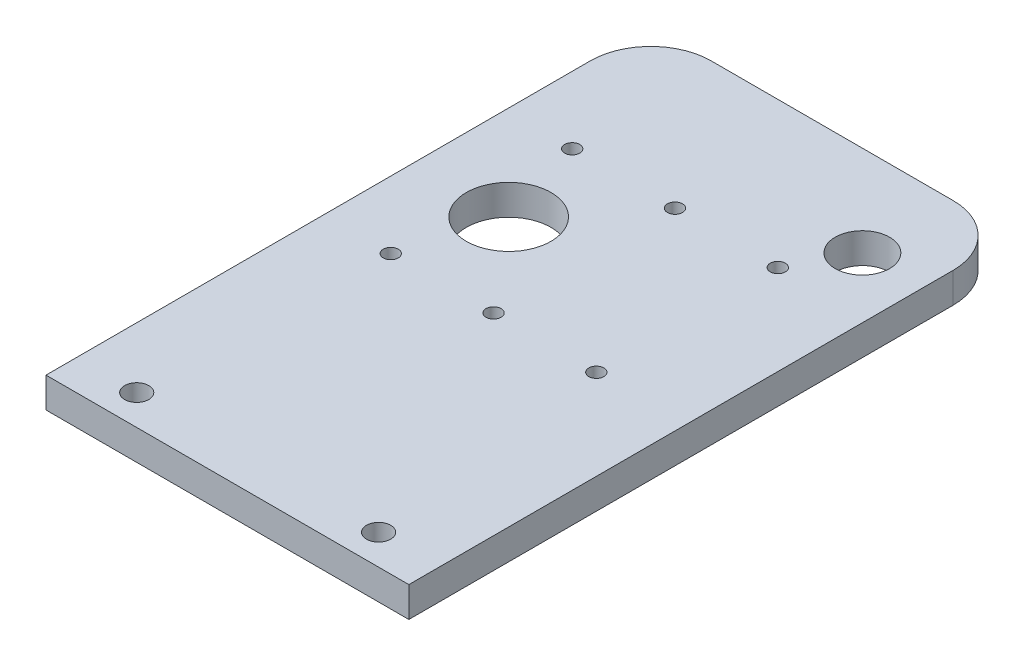
ISO-10303-21;
HEADER;
FILE_DESCRIPTION(('STEP AP214'),'2;1');
FILE_NAME('part.step','',(''),(''),'','','');
FILE_SCHEMA(('AUTOMOTIVE_DESIGN { 1 0 10303 214 1 1 1 1 }'));
ENDSEC;
DATA;
#1=APPLICATION_CONTEXT('core data for automotive mechanical design processes');
#2=APPLICATION_PROTOCOL_DEFINITION('international standard','automotive_design',2000,#1);
#3=PRODUCT_CONTEXT('',#1,'mechanical');
#4=PRODUCT('Part','Part','',(#3));
#5=PRODUCT_RELATED_PRODUCT_CATEGORY('part','',(#4));
#6=PRODUCT_DEFINITION_FORMATION('','',#4);
#7=PRODUCT_DEFINITION_CONTEXT('part definition',#1,'design');
#8=PRODUCT_DEFINITION('design','',#6,#7);
#9=PRODUCT_DEFINITION_SHAPE('','',#8);
#10=(LENGTH_UNIT() NAMED_UNIT(*) SI_UNIT(.MILLI.,.METRE.));
#11=(NAMED_UNIT(*) PLANE_ANGLE_UNIT() SI_UNIT($,.RADIAN.));
#12=(NAMED_UNIT(*) SI_UNIT($,.STERADIAN.) SOLID_ANGLE_UNIT());
#13=UNCERTAINTY_MEASURE_WITH_UNIT(LENGTH_MEASURE(1.E-05),#10,'distance_accuracy_value','');
#14=(GEOMETRIC_REPRESENTATION_CONTEXT(3) GLOBAL_UNCERTAINTY_ASSIGNED_CONTEXT((#13)) GLOBAL_UNIT_ASSIGNED_CONTEXT((#10,
#11,#12)) REPRESENTATION_CONTEXT('',''));
#15=CARTESIAN_POINT('',(0.,0.,0.));
#16=DIRECTION('',(0.,0.,1.));
#17=DIRECTION('',(1.,0.,0.));
#18=AXIS2_PLACEMENT_3D('',#15,#16,#17);
#19=CARTESIAN_POINT('',(-15.3287385690482,5.,-31.4506588296266));
#20=DIRECTION('',(0.,-1.,0.));
#21=DIRECTION('',(0.,0.,-1.));
#22=AXIS2_PLACEMENT_3D('',#19,#20,#21);
#23=PLANE('',#22);
#24=DIRECTION('',(1.,0.,0.));
#25=VECTOR('',#24,1.);
#26=CARTESIAN_POINT('',(-65.3287385690483,5.,58.5493411703734));
#27=LINE('',#26,#25);
#28=CARTESIAN_POINT('',(-65.3287385690483,5.,58.5493411703734));
#29=VERTEX_POINT('',#28);
#30=CARTESIAN_POINT('',(-5.32873856904824,5.,58.5493411703734));
#31=VERTEX_POINT('',#30);
#32=EDGE_CURVE('E93',#29,#31,#27,.T.);
#33=ORIENTED_EDGE('',*,*,#32,.T.);
#34=DIRECTION('',(0.,0.,-1.));
#35=VECTOR('',#34,1.);
#36=CARTESIAN_POINT('',(-5.32873856904824,5.,58.5493411703734));
#37=LINE('',#36,#35);
#38=CARTESIAN_POINT('',(-5.32873856904824,5.,-31.4506588296265));
#39=VERTEX_POINT('',#38);
#40=EDGE_CURVE('E165',#31,#39,#37,.T.);
#41=ORIENTED_EDGE('',*,*,#40,.T.);
#42=CARTESIAN_POINT('',(-15.3287385690482,5.,-31.4506588296266));
#43=DIRECTION('',(0.,1.,0.));
#44=DIRECTION('',(0.,0.,-1.));
#45=AXIS2_PLACEMENT_3D('',#42,#43,#44);
#46=CIRCLE('',#45,10.);
#47=CARTESIAN_POINT('',(-15.3287385690483,5.,-41.4506588296266));
#48=VERTEX_POINT('',#47);
#49=EDGE_CURVE('E107',#39,#48,#46,.T.);
#50=ORIENTED_EDGE('',*,*,#49,.T.);
#51=DIRECTION('',(-1.,0.,0.));
#52=VECTOR('',#51,1.);
#53=CARTESIAN_POINT('',(-55.3287385690482,5.,-41.4506588296266));
#54=LINE('',#53,#52);
#55=CARTESIAN_POINT('',(-55.3287385690483,5.,-41.4506588296266));
#56=VERTEX_POINT('',#55);
#57=EDGE_CURVE('E101',#48,#56,#54,.T.);
#58=ORIENTED_EDGE('',*,*,#57,.T.);
#59=CARTESIAN_POINT('',(-55.3287385690483,5.,-31.4506588296266));
#60=DIRECTION('',(0.,1.,0.));
#61=DIRECTION('',(0.,0.,-1.));
#62=AXIS2_PLACEMENT_3D('',#59,#60,#61);
#63=CIRCLE('',#62,9.99999999999999);
#64=CARTESIAN_POINT('',(-65.3287385690483,5.,-31.4506588296265));
#65=VERTEX_POINT('',#64);
#66=EDGE_CURVE('E105',#56,#65,#63,.T.);
#67=ORIENTED_EDGE('',*,*,#66,.T.);
#68=DIRECTION('',(0.,0.,1.));
#69=VECTOR('',#68,1.);
#70=CARTESIAN_POINT('',(-65.3287385690483,5.,-31.4506588296265));
#71=LINE('',#70,#69);
#72=EDGE_CURVE('E57',#65,#29,#71,.T.);
#73=ORIENTED_EDGE('',*,*,#72,.T.);
#74=EDGE_LOOP('',(#33,#41,#50,#58,#67,#73));
#75=FACE_BOUND('',#74,.T.);
#76=CARTESIAN_POINT('',(-49.7287385690482,5.,-2.36065882962656));
#77=DIRECTION('',(0.,1.,0.));
#78=DIRECTION('',(0.,0.,1.));
#79=AXIS2_PLACEMENT_3D('',#76,#77,#78);
#80=CIRCLE('',#79,7.);
#81=CARTESIAN_POINT('',(-49.7287385690482,5.,4.63934117037344));
#82=VERTEX_POINT('',#81);
#83=EDGE_CURVE('E132',#82,#82,#80,.T.);
#84=ORIENTED_EDGE('',*,*,#83,.F.);
#85=EDGE_LOOP('',(#84));
#86=FACE_BOUND('',#85,.T.);
#87=CARTESIAN_POINT('',(-55.3287385690482,5.,53.5493411703734));
#88=DIRECTION('',(0.,1.,0.));
#89=DIRECTION('',(0.,0.,1.));
#90=AXIS2_PLACEMENT_3D('',#87,#88,#89);
#91=CIRCLE('',#90,2.);
#92=CARTESIAN_POINT('',(-55.3287385690482,5.,55.5493411703734));
#93=VERTEX_POINT('',#92);
#94=EDGE_CURVE('E175',#93,#93,#91,.T.);
#95=ORIENTED_EDGE('',*,*,#94,.F.);
#96=EDGE_LOOP('',(#95));
#97=FACE_BOUND('',#96,.T.);
#98=CARTESIAN_POINT('',(-15.3287385690482,5.,53.5493411703734));
#99=DIRECTION('',(0.,1.,0.));
#100=DIRECTION('',(0.,0.,1.));
#101=AXIS2_PLACEMENT_3D('',#98,#99,#100);
#102=CIRCLE('',#101,2.);
#103=CARTESIAN_POINT('',(-15.3287385690482,5.,55.5493411703734));
#104=VERTEX_POINT('',#103);
#105=EDGE_CURVE('E183',#104,#104,#102,.T.);
#106=ORIENTED_EDGE('',*,*,#105,.F.);
#107=EDGE_LOOP('',(#106));
#108=FACE_BOUND('',#107,.T.);
#109=CARTESIAN_POINT('',(-15.3287385690482,5.,-26.4506588296266));
#110=DIRECTION('',(0.,1.,0.));
#111=DIRECTION('',(0.,0.,1.));
#112=AXIS2_PLACEMENT_3D('',#109,#110,#111);
#113=CIRCLE('',#112,4.5);
#114=CARTESIAN_POINT('',(-15.3287385690482,5.,-21.9506588296266));
#115=VERTEX_POINT('',#114);
#116=EDGE_CURVE('E191',#115,#115,#113,.T.);
#117=ORIENTED_EDGE('',*,*,#116,.F.);
#118=EDGE_LOOP('',(#117));
#119=FACE_BOUND('',#118,.T.);
#120=CARTESIAN_POINT('',(-54.2287385690482,5.,-17.3606588296266));
#121=DIRECTION('',(0.,1.,0.));
#122=DIRECTION('',(0.,0.,1.));
#123=AXIS2_PLACEMENT_3D('',#120,#121,#122);
#124=CIRCLE('',#123,1.25);
#125=CARTESIAN_POINT('',(-54.2287385690482,5.,-16.1106588296266));
#126=VERTEX_POINT('',#125);
#127=EDGE_CURVE('E199',#126,#126,#124,.T.);
#128=ORIENTED_EDGE('',*,*,#127,.F.);
#129=EDGE_LOOP('',(#128));
#130=FACE_BOUND('',#129,.T.);
#131=CARTESIAN_POINT('',(-20.2287385690482,5.,-17.3606588296266));
#132=DIRECTION('',(0.,1.,0.));
#133=DIRECTION('',(0.,0.,1.));
#134=AXIS2_PLACEMENT_3D('',#131,#132,#133);
#135=CIRCLE('',#134,1.25);
#136=CARTESIAN_POINT('',(-20.2287385690482,5.,-16.1106588296266));
#137=VERTEX_POINT('',#136);
#138=EDGE_CURVE('E207',#137,#137,#135,.T.);
#139=ORIENTED_EDGE('',*,*,#138,.F.);
#140=EDGE_LOOP('',(#139));
#141=FACE_BOUND('',#140,.T.);
#142=CARTESIAN_POINT('',(-37.2287385690482,5.,-17.3606588296266));
#143=DIRECTION('',(0.,1.,0.));
#144=DIRECTION('',(0.,0.,1.));
#145=AXIS2_PLACEMENT_3D('',#142,#143,#144);
#146=CIRCLE('',#145,1.25);
#147=CARTESIAN_POINT('',(-37.2287385690482,5.,-16.1106588296266));
#148=VERTEX_POINT('',#147);
#149=EDGE_CURVE('E215',#148,#148,#146,.T.);
#150=ORIENTED_EDGE('',*,*,#149,.F.);
#151=EDGE_LOOP('',(#150));
#152=FACE_BOUND('',#151,.T.);
#153=CARTESIAN_POINT('',(-54.2287385690482,5.,12.6393411703734));
#154=DIRECTION('',(0.,1.,0.));
#155=DIRECTION('',(0.,0.,1.));
#156=AXIS2_PLACEMENT_3D('',#153,#154,#155);
#157=CIRCLE('',#156,1.25);
#158=CARTESIAN_POINT('',(-54.2287385690482,5.,13.8893411703734));
#159=VERTEX_POINT('',#158);
#160=EDGE_CURVE('E223',#159,#159,#157,.T.);
#161=ORIENTED_EDGE('',*,*,#160,.F.);
#162=EDGE_LOOP('',(#161));
#163=FACE_BOUND('',#162,.T.);
#164=CARTESIAN_POINT('',(-20.2287385690482,5.,12.6393411703734));
#165=DIRECTION('',(0.,1.,0.));
#166=DIRECTION('',(0.,0.,1.));
#167=AXIS2_PLACEMENT_3D('',#164,#165,#166);
#168=CIRCLE('',#167,1.25);
#169=CARTESIAN_POINT('',(-20.2287385690482,5.,13.8893411703734));
#170=VERTEX_POINT('',#169);
#171=EDGE_CURVE('E231',#170,#170,#168,.T.);
#172=ORIENTED_EDGE('',*,*,#171,.F.);
#173=EDGE_LOOP('',(#172));
#174=FACE_BOUND('',#173,.T.);
#175=CARTESIAN_POINT('',(-37.2287385690482,5.,12.6393411703734));
#176=DIRECTION('',(0.,1.,0.));
#177=DIRECTION('',(0.,0.,1.));
#178=AXIS2_PLACEMENT_3D('',#175,#176,#177);
#179=CIRCLE('',#178,1.25);
#180=CARTESIAN_POINT('',(-37.2287385690482,5.,13.8893411703734));
#181=VERTEX_POINT('',#180);
#182=EDGE_CURVE('E239',#181,#181,#179,.T.);
#183=ORIENTED_EDGE('',*,*,#182,.F.);
#184=EDGE_LOOP('',(#183));
#185=FACE_BOUND('',#184,.T.);
#186=ADVANCED_FACE('F39',(#75,#86,#97,#108,#119,#130,#141,#152,#163,#174,#185),#23,.F.);
#187=CARTESIAN_POINT('',(-15.3287385690482,0.,-31.4506588296266));
#188=DIRECTION('',(0.,-1.,0.));
#189=DIRECTION('',(0.,0.,-1.));
#190=AXIS2_PLACEMENT_3D('',#187,#188,#189);
#191=PLANE('',#190);
#192=CARTESIAN_POINT('',(-20.2287385690482,0.,12.6393411703734));
#193=DIRECTION('',(0.,1.,0.));
#194=DIRECTION('',(0.,0.,1.));
#195=AXIS2_PLACEMENT_3D('',#192,#193,#194);
#196=CIRCLE('',#195,1.25);
#197=CARTESIAN_POINT('',(-20.2287385690482,0.,13.8893411703734));
#198=VERTEX_POINT('',#197);
#199=EDGE_CURVE('E235',#198,#198,#196,.T.);
#200=ORIENTED_EDGE('',*,*,#199,.T.);
#201=EDGE_LOOP('',(#200));
#202=FACE_BOUND('',#201,.T.);
#203=CARTESIAN_POINT('',(-37.2287385690482,0.,-17.3606588296266));
#204=DIRECTION('',(0.,1.,0.));
#205=DIRECTION('',(0.,0.,1.));
#206=AXIS2_PLACEMENT_3D('',#203,#204,#205);
#207=CIRCLE('',#206,1.25);
#208=CARTESIAN_POINT('',(-37.2287385690482,0.,-16.1106588296266));
#209=VERTEX_POINT('',#208);
#210=EDGE_CURVE('E219',#209,#209,#207,.T.);
#211=ORIENTED_EDGE('',*,*,#210,.T.);
#212=EDGE_LOOP('',(#211));
#213=FACE_BOUND('',#212,.T.);
#214=CARTESIAN_POINT('',(-54.2287385690482,0.,-17.3606588296266));
#215=DIRECTION('',(0.,1.,0.));
#216=DIRECTION('',(0.,0.,1.));
#217=AXIS2_PLACEMENT_3D('',#214,#215,#216);
#218=CIRCLE('',#217,1.25);
#219=CARTESIAN_POINT('',(-54.2287385690482,0.,-16.1106588296266));
#220=VERTEX_POINT('',#219);
#221=EDGE_CURVE('E203',#220,#220,#218,.T.);
#222=ORIENTED_EDGE('',*,*,#221,.T.);
#223=EDGE_LOOP('',(#222));
#224=FACE_BOUND('',#223,.T.);
#225=CARTESIAN_POINT('',(-15.3287385690482,0.,53.5493411703734));
#226=DIRECTION('',(0.,1.,0.));
#227=DIRECTION('',(0.,0.,1.));
#228=AXIS2_PLACEMENT_3D('',#225,#226,#227);
#229=CIRCLE('',#228,2.);
#230=CARTESIAN_POINT('',(-15.3287385690482,0.,55.5493411703734));
#231=VERTEX_POINT('',#230);
#232=EDGE_CURVE('E187',#231,#231,#229,.T.);
#233=ORIENTED_EDGE('',*,*,#232,.T.);
#234=EDGE_LOOP('',(#233));
#235=FACE_BOUND('',#234,.T.);
#236=CARTESIAN_POINT('',(-49.7287385690482,0.,-2.36065882962656));
#237=DIRECTION('',(0.,1.,0.));
#238=DIRECTION('',(0.,0.,1.));
#239=AXIS2_PLACEMENT_3D('',#236,#237,#238);
#240=CIRCLE('',#239,7.);
#241=CARTESIAN_POINT('',(-49.7287385690482,0.,4.63934117037344));
#242=VERTEX_POINT('',#241);
#243=EDGE_CURVE('E170',#242,#242,#240,.T.);
#244=ORIENTED_EDGE('',*,*,#243,.T.);
#245=EDGE_LOOP('',(#244));
#246=FACE_BOUND('',#245,.T.);
#247=DIRECTION('',(1.,0.,0.));
#248=VECTOR('',#247,1.);
#249=CARTESIAN_POINT('',(-15.3287385690482,0.,58.5493411703734));
#250=LINE('',#249,#248);
#251=CARTESIAN_POINT('',(-65.3287385690483,0.,58.5493411703734));
#252=VERTEX_POINT('',#251);
#253=CARTESIAN_POINT('',(-5.32873856904824,0.,58.5493411703734));
#254=VERTEX_POINT('',#253);
#255=EDGE_CURVE('E87',#252,#254,#250,.T.);
#256=ORIENTED_EDGE('',*,*,#255,.F.);
#257=DIRECTION('',(0.,0.,1.));
#258=VECTOR('',#257,1.);
#259=CARTESIAN_POINT('',(-65.3287385690483,0.,-31.4506588296265));
#260=LINE('',#259,#258);
#261=CARTESIAN_POINT('',(-65.3287385690483,0.,-31.4506588296265));
#262=VERTEX_POINT('',#261);
#263=EDGE_CURVE('E142',#262,#252,#260,.T.);
#264=ORIENTED_EDGE('',*,*,#263,.F.);
#265=CARTESIAN_POINT('',(-55.3287385690483,0.,-31.4506588296266));
#266=DIRECTION('',(0.,1.,0.));
#267=DIRECTION('',(0.,0.,-1.));
#268=AXIS2_PLACEMENT_3D('',#265,#266,#267);
#269=CIRCLE('',#268,9.99999999999999);
#270=CARTESIAN_POINT('',(-55.3287385690483,0.,-41.4506588296266));
#271=VERTEX_POINT('',#270);
#272=EDGE_CURVE('E80',#271,#262,#269,.T.);
#273=ORIENTED_EDGE('',*,*,#272,.F.);
#274=DIRECTION('',(-1.,0.,0.));
#275=VECTOR('',#274,1.);
#276=CARTESIAN_POINT('',(-55.3287385690482,0.,-41.4506588296266));
#277=LINE('',#276,#275);
#278=CARTESIAN_POINT('',(-15.3287385690483,0.,-41.4506588296266));
#279=VERTEX_POINT('',#278);
#280=EDGE_CURVE('E116',#279,#271,#277,.T.);
#281=ORIENTED_EDGE('',*,*,#280,.F.);
#282=CARTESIAN_POINT('',(-15.3287385690482,0.,-31.4506588296266));
#283=DIRECTION('',(0.,1.,0.));
#284=DIRECTION('',(0.,0.,-1.));
#285=AXIS2_PLACEMENT_3D('',#282,#283,#284);
#286=CIRCLE('',#285,10.);
#287=CARTESIAN_POINT('',(-5.32873856904824,0.,-31.4506588296265));
#288=VERTEX_POINT('',#287);
#289=EDGE_CURVE('E135',#288,#279,#286,.T.);
#290=ORIENTED_EDGE('',*,*,#289,.F.);
#291=DIRECTION('',(0.,0.,-1.));
#292=VECTOR('',#291,1.);
#293=CARTESIAN_POINT('',(-5.32873856904825,0.,-31.4506588296265));
#294=LINE('',#293,#292);
#295=EDGE_CURVE('E131',#254,#288,#294,.T.);
#296=ORIENTED_EDGE('',*,*,#295,.F.);
#297=EDGE_LOOP('',(#256,#264,#273,#281,#290,#296));
#298=FACE_BOUND('',#297,.T.);
#299=CARTESIAN_POINT('',(-55.3287385690482,0.,53.5493411703734));
#300=DIRECTION('',(0.,1.,0.));
#301=DIRECTION('',(0.,0.,1.));
#302=AXIS2_PLACEMENT_3D('',#299,#300,#301);
#303=CIRCLE('',#302,2.);
#304=CARTESIAN_POINT('',(-55.3287385690482,0.,55.5493411703734));
#305=VERTEX_POINT('',#304);
#306=EDGE_CURVE('E179',#305,#305,#303,.T.);
#307=ORIENTED_EDGE('',*,*,#306,.T.);
#308=EDGE_LOOP('',(#307));
#309=FACE_BOUND('',#308,.T.);
#310=CARTESIAN_POINT('',(-15.3287385690482,0.,-26.4506588296266));
#311=DIRECTION('',(0.,1.,0.));
#312=DIRECTION('',(0.,0.,1.));
#313=AXIS2_PLACEMENT_3D('',#310,#311,#312);
#314=CIRCLE('',#313,4.5);
#315=CARTESIAN_POINT('',(-15.3287385690482,0.,-21.9506588296266));
#316=VERTEX_POINT('',#315);
#317=EDGE_CURVE('E195',#316,#316,#314,.T.);
#318=ORIENTED_EDGE('',*,*,#317,.T.);
#319=EDGE_LOOP('',(#318));
#320=FACE_BOUND('',#319,.T.);
#321=CARTESIAN_POINT('',(-20.2287385690482,0.,-17.3606588296266));
#322=DIRECTION('',(0.,1.,0.));
#323=DIRECTION('',(0.,0.,1.));
#324=AXIS2_PLACEMENT_3D('',#321,#322,#323);
#325=CIRCLE('',#324,1.25);
#326=CARTESIAN_POINT('',(-20.2287385690482,0.,-16.1106588296266));
#327=VERTEX_POINT('',#326);
#328=EDGE_CURVE('E211',#327,#327,#325,.T.);
#329=ORIENTED_EDGE('',*,*,#328,.T.);
#330=EDGE_LOOP('',(#329));
#331=FACE_BOUND('',#330,.T.);
#332=CARTESIAN_POINT('',(-54.2287385690482,0.,12.6393411703734));
#333=DIRECTION('',(0.,1.,0.));
#334=DIRECTION('',(0.,0.,1.));
#335=AXIS2_PLACEMENT_3D('',#332,#333,#334);
#336=CIRCLE('',#335,1.25);
#337=CARTESIAN_POINT('',(-54.2287385690482,0.,13.8893411703734));
#338=VERTEX_POINT('',#337);
#339=EDGE_CURVE('E227',#338,#338,#336,.T.);
#340=ORIENTED_EDGE('',*,*,#339,.T.);
#341=EDGE_LOOP('',(#340));
#342=FACE_BOUND('',#341,.T.);
#343=CARTESIAN_POINT('',(-37.2287385690482,0.,12.6393411703734));
#344=DIRECTION('',(0.,1.,0.));
#345=DIRECTION('',(0.,0.,1.));
#346=AXIS2_PLACEMENT_3D('',#343,#344,#345);
#347=CIRCLE('',#346,1.25);
#348=CARTESIAN_POINT('',(-37.2287385690482,0.,13.8893411703734));
#349=VERTEX_POINT('',#348);
#350=EDGE_CURVE('E243',#349,#349,#347,.T.);
#351=ORIENTED_EDGE('',*,*,#350,.T.);
#352=EDGE_LOOP('',(#351));
#353=FACE_BOUND('',#352,.T.);
#354=ADVANCED_FACE('F159',(#202,#213,#224,#235,#246,#298,#309,#320,#331,#342,#353),#191,.T.);
#355=CARTESIAN_POINT('',(-15.3287385690482,5.,58.5493411703734));
#356=DIRECTION('',(0.,0.,-1.));
#357=DIRECTION('',(-1.,0.,0.));
#358=AXIS2_PLACEMENT_3D('',#355,#356,#357);
#359=PLANE('',#358);
#360=ORIENTED_EDGE('',*,*,#255,.T.);
#361=DIRECTION('',(0.,-1.,0.));
#362=VECTOR('',#361,1.);
#363=CARTESIAN_POINT('',(-5.32873856904824,5.,58.5493411703734));
#364=LINE('',#363,#362);
#365=EDGE_CURVE('E11',#31,#254,#364,.T.);
#366=ORIENTED_EDGE('',*,*,#365,.F.);
#367=ORIENTED_EDGE('',*,*,#32,.F.);
#368=DIRECTION('',(0.,-1.,0.));
#369=VECTOR('',#368,1.);
#370=CARTESIAN_POINT('',(-65.3287385690483,5.,58.5493411703734));
#371=LINE('',#370,#369);
#372=EDGE_CURVE('E125',#29,#252,#371,.T.);
#373=ORIENTED_EDGE('',*,*,#372,.T.);
#374=EDGE_LOOP('',(#360,#366,#367,#373));
#375=FACE_BOUND('',#374,.T.);
#376=ADVANCED_FACE('F41',(#375),#359,.F.);
#377=CARTESIAN_POINT('',(-5.32873856904825,5.,-31.4506588296265));
#378=DIRECTION('',(-1.,0.,0.));
#379=DIRECTION('',(0.,0.,1.));
#380=AXIS2_PLACEMENT_3D('',#377,#378,#379);
#381=PLANE('',#380);
#382=ORIENTED_EDGE('',*,*,#295,.T.);
#383=DIRECTION('',(0.,-1.,0.));
#384=VECTOR('',#383,1.);
#385=CARTESIAN_POINT('',(-5.32873856904824,5.,-31.4506588296265));
#386=LINE('',#385,#384);
#387=EDGE_CURVE('E49',#39,#288,#386,.T.);
#388=ORIENTED_EDGE('',*,*,#387,.F.);
#389=ORIENTED_EDGE('',*,*,#40,.F.);
#390=ORIENTED_EDGE('',*,*,#365,.T.);
#391=EDGE_LOOP('',(#382,#388,#389,#390));
#392=FACE_BOUND('',#391,.T.);
#393=ADVANCED_FACE('F272',(#392),#381,.F.);
#394=CARTESIAN_POINT('',(-15.3287385690482,5.,-31.4506588296266));
#395=DIRECTION('',(0.,-1.,0.));
#396=DIRECTION('',(0.,0.,-1.));
#397=AXIS2_PLACEMENT_3D('',#394,#395,#396);
#398=CYLINDRICAL_SURFACE('',#397,10.);
#399=ORIENTED_EDGE('',*,*,#289,.T.);
#400=DIRECTION('',(0.,-1.,0.));
#401=VECTOR('',#400,1.);
#402=CARTESIAN_POINT('',(-15.3287385690483,5.,-41.4506588296266));
#403=LINE('',#402,#401);
#404=EDGE_CURVE('E118',#48,#279,#403,.T.);
#405=ORIENTED_EDGE('',*,*,#404,.F.);
#406=ORIENTED_EDGE('',*,*,#49,.F.);
#407=ORIENTED_EDGE('',*,*,#387,.T.);
#408=EDGE_LOOP('',(#399,#405,#406,#407));
#409=FACE_BOUND('',#408,.T.);
#410=ADVANCED_FACE('F156',(#409),#398,.T.);
#411=CARTESIAN_POINT('',(-55.3287385690482,5.,-41.4506588296266));
#412=DIRECTION('',(0.,0.,1.));
#413=DIRECTION('',(1.,0.,0.));
#414=AXIS2_PLACEMENT_3D('',#411,#412,#413);
#415=PLANE('',#414);
#416=ORIENTED_EDGE('',*,*,#280,.T.);
#417=DIRECTION('',(0.,-1.,0.));
#418=VECTOR('',#417,1.);
#419=CARTESIAN_POINT('',(-55.3287385690483,5.,-41.4506588296266));
#420=LINE('',#419,#418);
#421=EDGE_CURVE('E113',#56,#271,#420,.T.);
#422=ORIENTED_EDGE('',*,*,#421,.F.);
#423=ORIENTED_EDGE('',*,*,#57,.F.);
#424=ORIENTED_EDGE('',*,*,#404,.T.);
#425=EDGE_LOOP('',(#416,#422,#423,#424));
#426=FACE_BOUND('',#425,.T.);
#427=ADVANCED_FACE('F114',(#426),#415,.F.);
#428=CARTESIAN_POINT('',(-55.3287385690483,5.,-31.4506588296266));
#429=DIRECTION('',(0.,-1.,0.));
#430=DIRECTION('',(0.,0.,-1.));
#431=AXIS2_PLACEMENT_3D('',#428,#429,#430);
#432=CYLINDRICAL_SURFACE('',#431,9.99999999999999);
#433=ORIENTED_EDGE('',*,*,#272,.T.);
#434=DIRECTION('',(0.,-1.,0.));
#435=VECTOR('',#434,1.);
#436=CARTESIAN_POINT('',(-65.3287385690483,5.,-31.4506588296265));
#437=LINE('',#436,#435);
#438=EDGE_CURVE('E119',#65,#262,#437,.T.);
#439=ORIENTED_EDGE('',*,*,#438,.F.);
#440=ORIENTED_EDGE('',*,*,#66,.F.);
#441=ORIENTED_EDGE('',*,*,#421,.T.);
#442=EDGE_LOOP('',(#433,#439,#440,#441));
#443=FACE_BOUND('',#442,.T.);
#444=ADVANCED_FACE('F121',(#443),#432,.T.);
#445=CARTESIAN_POINT('',(-65.3287385690483,5.,-31.4506588296265));
#446=DIRECTION('',(1.,0.,0.));
#447=DIRECTION('',(0.,0.,-1.));
#448=AXIS2_PLACEMENT_3D('',#445,#446,#447);
#449=PLANE('',#448);
#450=ORIENTED_EDGE('',*,*,#263,.T.);
#451=ORIENTED_EDGE('',*,*,#372,.F.);
#452=ORIENTED_EDGE('',*,*,#72,.F.);
#453=ORIENTED_EDGE('',*,*,#438,.T.);
#454=EDGE_LOOP('',(#450,#451,#452,#453));
#455=FACE_BOUND('',#454,.T.);
#456=ADVANCED_FACE('F162',(#455),#449,.F.);
#457=CARTESIAN_POINT('',(-49.7287385690482,5.,-2.36065882962656));
#458=DIRECTION('',(0.,-1.,0.));
#459=DIRECTION('',(0.,0.,-1.));
#460=AXIS2_PLACEMENT_3D('',#457,#458,#459);
#461=CYLINDRICAL_SURFACE('',#460,7.);
#462=ORIENTED_EDGE('',*,*,#83,.T.);
#463=EDGE_LOOP('',(#462));
#464=FACE_BOUND('',#463,.T.);
#465=ORIENTED_EDGE('',*,*,#243,.F.);
#466=EDGE_LOOP('',(#465));
#467=FACE_BOUND('',#466,.T.);
#468=ADVANCED_FACE('F262',(#464,#467),#461,.F.);
#469=CARTESIAN_POINT('',(-55.3287385690482,5.,53.5493411703734));
#470=DIRECTION('',(0.,-1.,0.));
#471=DIRECTION('',(0.,0.,-1.));
#472=AXIS2_PLACEMENT_3D('',#469,#470,#471);
#473=CYLINDRICAL_SURFACE('',#472,2.);
#474=ORIENTED_EDGE('',*,*,#94,.T.);
#475=EDGE_LOOP('',(#474));
#476=FACE_BOUND('',#475,.T.);
#477=ORIENTED_EDGE('',*,*,#306,.F.);
#478=EDGE_LOOP('',(#477));
#479=FACE_BOUND('',#478,.T.);
#480=ADVANCED_FACE('F332',(#476,#479),#473,.F.);
#481=CARTESIAN_POINT('',(-15.3287385690482,5.,53.5493411703734));
#482=DIRECTION('',(0.,-1.,0.));
#483=DIRECTION('',(0.,0.,-1.));
#484=AXIS2_PLACEMENT_3D('',#481,#482,#483);
#485=CYLINDRICAL_SURFACE('',#484,2.);
#486=ORIENTED_EDGE('',*,*,#105,.T.);
#487=EDGE_LOOP('',(#486));
#488=FACE_BOUND('',#487,.T.);
#489=ORIENTED_EDGE('',*,*,#232,.F.);
#490=EDGE_LOOP('',(#489));
#491=FACE_BOUND('',#490,.T.);
#492=ADVANCED_FACE('F340',(#488,#491),#485,.F.);
#493=CARTESIAN_POINT('',(-15.3287385690482,5.,-26.4506588296266));
#494=DIRECTION('',(0.,-1.,0.));
#495=DIRECTION('',(0.,0.,-1.));
#496=AXIS2_PLACEMENT_3D('',#493,#494,#495);
#497=CYLINDRICAL_SURFACE('',#496,4.5);
#498=ORIENTED_EDGE('',*,*,#116,.T.);
#499=EDGE_LOOP('',(#498));
#500=FACE_BOUND('',#499,.T.);
#501=ORIENTED_EDGE('',*,*,#317,.F.);
#502=EDGE_LOOP('',(#501));
#503=FACE_BOUND('',#502,.T.);
#504=ADVANCED_FACE('F348',(#500,#503),#497,.F.);
#505=CARTESIAN_POINT('',(-54.2287385690482,5.,-17.3606588296266));
#506=DIRECTION('',(0.,-1.,0.));
#507=DIRECTION('',(0.,0.,-1.));
#508=AXIS2_PLACEMENT_3D('',#505,#506,#507);
#509=CYLINDRICAL_SURFACE('',#508,1.25);
#510=ORIENTED_EDGE('',*,*,#127,.T.);
#511=EDGE_LOOP('',(#510));
#512=FACE_BOUND('',#511,.T.);
#513=ORIENTED_EDGE('',*,*,#221,.F.);
#514=EDGE_LOOP('',(#513));
#515=FACE_BOUND('',#514,.T.);
#516=ADVANCED_FACE('F357',(#512,#515),#509,.F.);
#517=CARTESIAN_POINT('',(-20.2287385690482,5.,-17.3606588296266));
#518=DIRECTION('',(0.,-1.,0.));
#519=DIRECTION('',(0.,0.,-1.));
#520=AXIS2_PLACEMENT_3D('',#517,#518,#519);
#521=CYLINDRICAL_SURFACE('',#520,1.25);
#522=ORIENTED_EDGE('',*,*,#138,.T.);
#523=EDGE_LOOP('',(#522));
#524=FACE_BOUND('',#523,.T.);
#525=ORIENTED_EDGE('',*,*,#328,.F.);
#526=EDGE_LOOP('',(#525));
#527=FACE_BOUND('',#526,.T.);
#528=ADVANCED_FACE('F366',(#524,#527),#521,.F.);
#529=CARTESIAN_POINT('',(-37.2287385690482,5.,-17.3606588296266));
#530=DIRECTION('',(0.,-1.,0.));
#531=DIRECTION('',(0.,0.,-1.));
#532=AXIS2_PLACEMENT_3D('',#529,#530,#531);
#533=CYLINDRICAL_SURFACE('',#532,1.25);
#534=ORIENTED_EDGE('',*,*,#149,.T.);
#535=EDGE_LOOP('',(#534));
#536=FACE_BOUND('',#535,.T.);
#537=ORIENTED_EDGE('',*,*,#210,.F.);
#538=EDGE_LOOP('',(#537));
#539=FACE_BOUND('',#538,.T.);
#540=ADVANCED_FACE('F375',(#536,#539),#533,.F.);
#541=CARTESIAN_POINT('',(-54.2287385690482,5.,12.6393411703734));
#542=DIRECTION('',(0.,-1.,0.));
#543=DIRECTION('',(0.,0.,-1.));
#544=AXIS2_PLACEMENT_3D('',#541,#542,#543);
#545=CYLINDRICAL_SURFACE('',#544,1.25);
#546=ORIENTED_EDGE('',*,*,#160,.T.);
#547=EDGE_LOOP('',(#546));
#548=FACE_BOUND('',#547,.T.);
#549=ORIENTED_EDGE('',*,*,#339,.F.);
#550=EDGE_LOOP('',(#549));
#551=FACE_BOUND('',#550,.T.);
#552=ADVANCED_FACE('F384',(#548,#551),#545,.F.);
#553=CARTESIAN_POINT('',(-20.2287385690482,5.,12.6393411703734));
#554=DIRECTION('',(0.,-1.,0.));
#555=DIRECTION('',(0.,0.,-1.));
#556=AXIS2_PLACEMENT_3D('',#553,#554,#555);
#557=CYLINDRICAL_SURFACE('',#556,1.25);
#558=ORIENTED_EDGE('',*,*,#171,.T.);
#559=EDGE_LOOP('',(#558));
#560=FACE_BOUND('',#559,.T.);
#561=ORIENTED_EDGE('',*,*,#199,.F.);
#562=EDGE_LOOP('',(#561));
#563=FACE_BOUND('',#562,.T.);
#564=ADVANCED_FACE('F393',(#560,#563),#557,.F.);
#565=CARTESIAN_POINT('',(-37.2287385690482,5.,12.6393411703734));
#566=DIRECTION('',(0.,-1.,0.));
#567=DIRECTION('',(0.,0.,-1.));
#568=AXIS2_PLACEMENT_3D('',#565,#566,#567);
#569=CYLINDRICAL_SURFACE('',#568,1.25);
#570=ORIENTED_EDGE('',*,*,#182,.T.);
#571=EDGE_LOOP('',(#570));
#572=FACE_BOUND('',#571,.T.);
#573=ORIENTED_EDGE('',*,*,#350,.F.);
#574=EDGE_LOOP('',(#573));
#575=FACE_BOUND('',#574,.T.);
#576=ADVANCED_FACE('F251',(#572,#575),#569,.F.);
#577=CLOSED_SHELL('',(#186,#354,#376,#393,#410,#427,#444,#456,#468,#480,#492,#504,#516,#528,
#540,#552,#564,#576));
#578=MANIFOLD_SOLID_BREP('B2',#577);
#579=ADVANCED_BREP_SHAPE_REPRESENTATION('',(#18,#578),#14);
#580=SHAPE_DEFINITION_REPRESENTATION(#9,#579);
ENDSEC;
END-ISO-10303-21;
